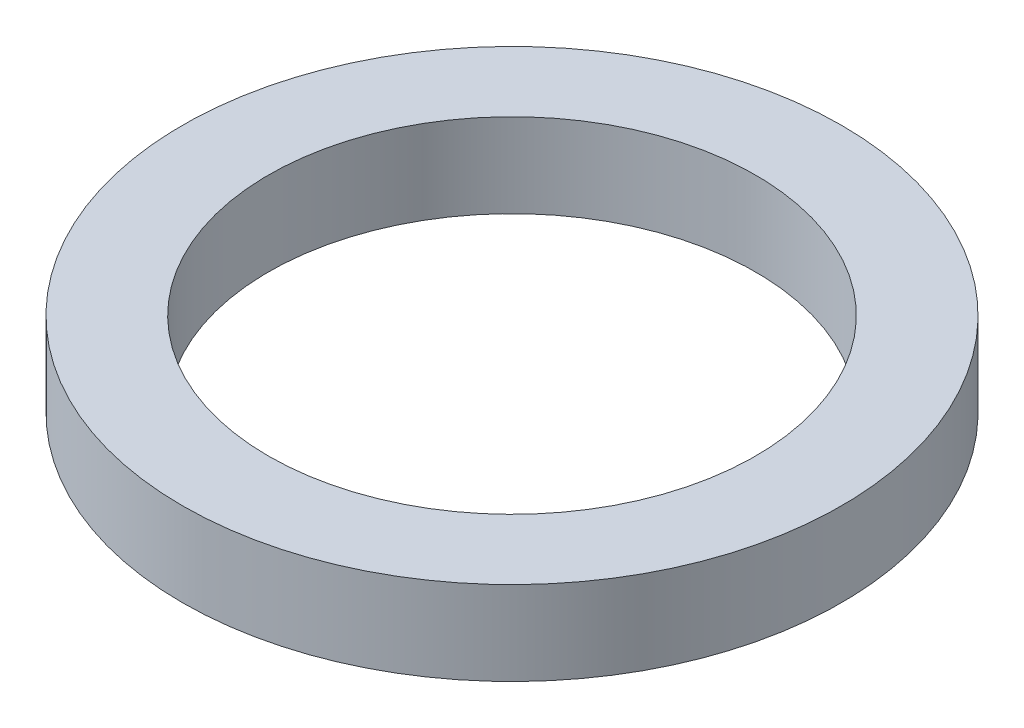
ISO-10303-21;
HEADER;
FILE_DESCRIPTION(('STEP AP214'),'2;1');
FILE_NAME('part.step','',(''),(''),'','','');
FILE_SCHEMA(('AUTOMOTIVE_DESIGN { 1 0 10303 214 1 1 1 1 }'));
ENDSEC;
DATA;
#1=APPLICATION_CONTEXT('core data for automotive mechanical design processes');
#2=APPLICATION_PROTOCOL_DEFINITION('international standard','automotive_design',2000,#1);
#3=PRODUCT_CONTEXT('',#1,'mechanical');
#4=PRODUCT('Part','Part','',(#3));
#5=PRODUCT_RELATED_PRODUCT_CATEGORY('part','',(#4));
#6=PRODUCT_DEFINITION_FORMATION('','',#4);
#7=PRODUCT_DEFINITION_CONTEXT('part definition',#1,'design');
#8=PRODUCT_DEFINITION('design','',#6,#7);
#9=PRODUCT_DEFINITION_SHAPE('','',#8);
#10=(LENGTH_UNIT() NAMED_UNIT(*) SI_UNIT(.MILLI.,.METRE.));
#11=(NAMED_UNIT(*) PLANE_ANGLE_UNIT() SI_UNIT($,.RADIAN.));
#12=(NAMED_UNIT(*) SI_UNIT($,.STERADIAN.) SOLID_ANGLE_UNIT());
#13=UNCERTAINTY_MEASURE_WITH_UNIT(LENGTH_MEASURE(1.E-05),#10,'distance_accuracy_value','');
#14=(GEOMETRIC_REPRESENTATION_CONTEXT(3) GLOBAL_UNCERTAINTY_ASSIGNED_CONTEXT((#13)) GLOBAL_UNIT_ASSIGNED_CONTEXT((#10,
#11,#12)) REPRESENTATION_CONTEXT('',''));
#15=CARTESIAN_POINT('',(0.,0.,0.));
#16=DIRECTION('',(0.,0.,1.));
#17=DIRECTION('',(1.,0.,0.));
#18=AXIS2_PLACEMENT_3D('',#15,#16,#17);
#19=CARTESIAN_POINT('',(0.,1.,0.));
#20=DIRECTION('',(0.,1.,0.));
#21=DIRECTION('',(0.,0.,1.));
#22=AXIS2_PLACEMENT_3D('',#19,#20,#21);
#23=PLANE('',#22);
#24=CARTESIAN_POINT('',(0.,1.,0.));
#25=DIRECTION('',(0.,1.,0.));
#26=DIRECTION('',(0.,0.,1.));
#27=AXIS2_PLACEMENT_3D('',#24,#25,#26);
#28=CIRCLE('',#27,7.85);
#29=CARTESIAN_POINT('',(0.,1.,7.85));
#30=VERTEX_POINT('',#29);
#31=EDGE_CURVE('E10',#30,#30,#28,.T.);
#32=ORIENTED_EDGE('',*,*,#31,.T.);
#33=EDGE_LOOP('',(#32));
#34=FACE_BOUND('',#33,.T.);
#35=CARTESIAN_POINT('',(0.,1.,0.));
#36=DIRECTION('',(0.,1.,0.));
#37=DIRECTION('',(0.,0.,1.));
#38=AXIS2_PLACEMENT_3D('',#35,#36,#37);
#39=CIRCLE('',#38,5.8);
#40=CARTESIAN_POINT('',(0.,1.,5.8));
#41=VERTEX_POINT('',#40);
#42=EDGE_CURVE('E55',#41,#41,#39,.T.);
#43=ORIENTED_EDGE('',*,*,#42,.F.);
#44=EDGE_LOOP('',(#43));
#45=FACE_BOUND('',#44,.T.);
#46=ADVANCED_FACE('F41',(#34,#45),#23,.T.);
#47=CARTESIAN_POINT('',(0.,-1.,0.));
#48=DIRECTION('',(0.,1.,0.));
#49=DIRECTION('',(0.,0.,1.));
#50=AXIS2_PLACEMENT_3D('',#47,#48,#49);
#51=PLANE('',#50);
#52=CARTESIAN_POINT('',(0.,-1.,0.));
#53=DIRECTION('',(0.,1.,0.));
#54=DIRECTION('',(0.,0.,1.));
#55=AXIS2_PLACEMENT_3D('',#52,#53,#54);
#56=CIRCLE('',#55,7.85);
#57=CARTESIAN_POINT('',(0.,-1.,7.85));
#58=VERTEX_POINT('',#57);
#59=EDGE_CURVE('E44',#58,#58,#56,.T.);
#60=ORIENTED_EDGE('',*,*,#59,.F.);
#61=EDGE_LOOP('',(#60));
#62=FACE_BOUND('',#61,.T.);
#63=CARTESIAN_POINT('',(0.,-1.,0.));
#64=DIRECTION('',(0.,1.,0.));
#65=DIRECTION('',(0.,0.,1.));
#66=AXIS2_PLACEMENT_3D('',#63,#64,#65);
#67=CIRCLE('',#66,5.8);
#68=CARTESIAN_POINT('',(0.,-1.,5.8));
#69=VERTEX_POINT('',#68);
#70=EDGE_CURVE('E53',#69,#69,#67,.T.);
#71=ORIENTED_EDGE('',*,*,#70,.T.);
#72=EDGE_LOOP('',(#71));
#73=FACE_BOUND('',#72,.T.);
#74=ADVANCED_FACE('F63',(#62,#73),#51,.F.);
#75=CARTESIAN_POINT('',(0.,1.,0.));
#76=DIRECTION('',(0.,-1.,0.));
#77=DIRECTION('',(0.,0.,-1.));
#78=AXIS2_PLACEMENT_3D('',#75,#76,#77);
#79=CYLINDRICAL_SURFACE('',#78,7.85);
#80=ORIENTED_EDGE('',*,*,#31,.F.);
#81=EDGE_LOOP('',(#80));
#82=FACE_BOUND('',#81,.T.);
#83=ORIENTED_EDGE('',*,*,#59,.T.);
#84=EDGE_LOOP('',(#83));
#85=FACE_BOUND('',#84,.T.);
#86=ADVANCED_FACE('F43',(#82,#85),#79,.T.);
#87=CARTESIAN_POINT('',(0.,1.,0.));
#88=DIRECTION('',(0.,-1.,0.));
#89=DIRECTION('',(0.,0.,-1.));
#90=AXIS2_PLACEMENT_3D('',#87,#88,#89);
#91=CYLINDRICAL_SURFACE('',#90,5.8);
#92=ORIENTED_EDGE('',*,*,#42,.T.);
#93=EDGE_LOOP('',(#92));
#94=FACE_BOUND('',#93,.T.);
#95=ORIENTED_EDGE('',*,*,#70,.F.);
#96=EDGE_LOOP('',(#95));
#97=FACE_BOUND('',#96,.T.);
#98=ADVANCED_FACE('F58',(#94,#97),#91,.F.);
#99=CLOSED_SHELL('',(#46,#74,#86,#98));
#100=MANIFOLD_SOLID_BREP('B2',#99);
#101=ADVANCED_BREP_SHAPE_REPRESENTATION('',(#18,#100),#14);
#102=SHAPE_DEFINITION_REPRESENTATION(#9,#101);
ENDSEC;
END-ISO-10303-21;
